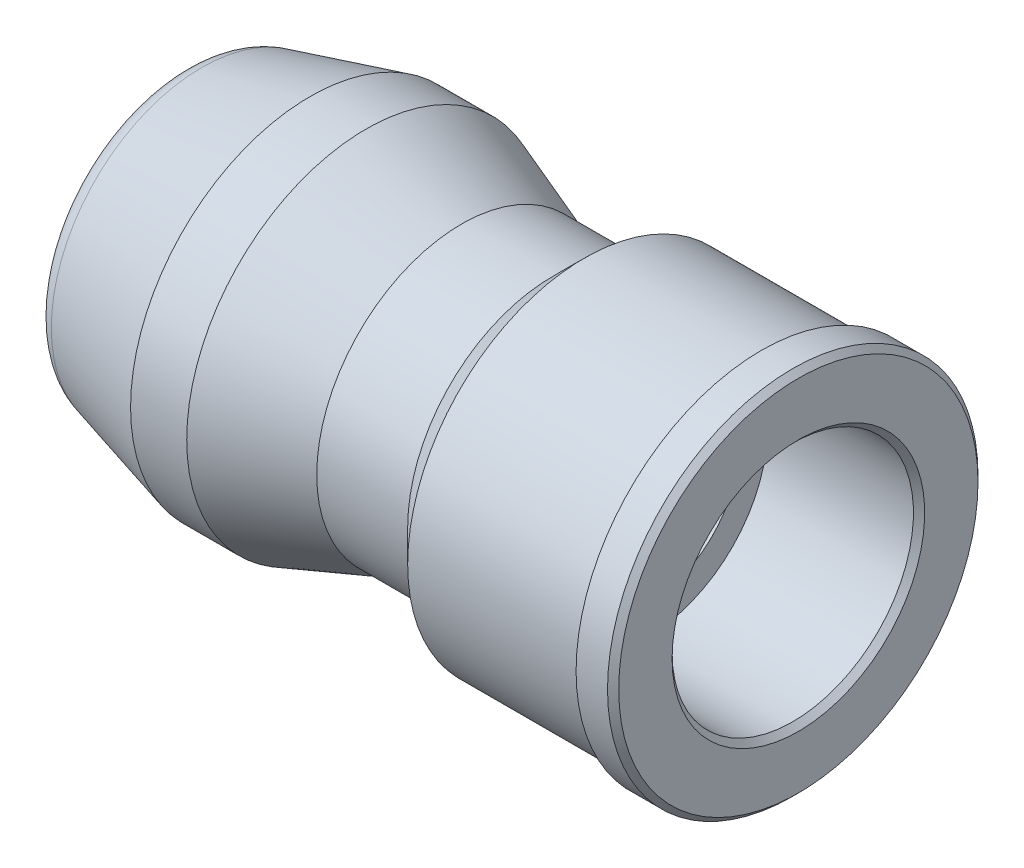
ISO-10303-21;
HEADER;
FILE_DESCRIPTION(('STEP AP214'),'2;1');
FILE_NAME('part.step','',(''),(''),'','','');
FILE_SCHEMA(('AUTOMOTIVE_DESIGN { 1 0 10303 214 1 1 1 1 }'));
ENDSEC;
DATA;
#1=APPLICATION_CONTEXT('core data for automotive mechanical design processes');
#2=APPLICATION_PROTOCOL_DEFINITION('international standard','automotive_design',2000,#1);
#3=PRODUCT_CONTEXT('',#1,'mechanical');
#4=PRODUCT('Part','Part','',(#3));
#5=PRODUCT_RELATED_PRODUCT_CATEGORY('part','',(#4));
#6=PRODUCT_DEFINITION_FORMATION('','',#4);
#7=PRODUCT_DEFINITION_CONTEXT('part definition',#1,'design');
#8=PRODUCT_DEFINITION('design','',#6,#7);
#9=PRODUCT_DEFINITION_SHAPE('','',#8);
#10=(LENGTH_UNIT() NAMED_UNIT(*) SI_UNIT(.MILLI.,.METRE.));
#11=(NAMED_UNIT(*) PLANE_ANGLE_UNIT() SI_UNIT($,.RADIAN.));
#12=(NAMED_UNIT(*) SI_UNIT($,.STERADIAN.) SOLID_ANGLE_UNIT());
#13=UNCERTAINTY_MEASURE_WITH_UNIT(LENGTH_MEASURE(1.E-05),#10,'distance_accuracy_value','');
#14=(GEOMETRIC_REPRESENTATION_CONTEXT(3) GLOBAL_UNCERTAINTY_ASSIGNED_CONTEXT((#13)) GLOBAL_UNIT_ASSIGNED_CONTEXT((#10,
#11,#12)) REPRESENTATION_CONTEXT('',''));
#15=CARTESIAN_POINT('',(0.,0.,0.));
#16=DIRECTION('',(0.,0.,1.));
#17=DIRECTION('',(1.,0.,0.));
#18=AXIS2_PLACEMENT_3D('',#15,#16,#17);
#19=CARTESIAN_POINT('',(-24.3822963616304,0.,0.));
#20=DIRECTION('',(1.,0.,0.));
#21=DIRECTION('',(0.,0.,-1.));
#22=AXIS2_PLACEMENT_3D('',#19,#20,#21);
#23=PLANE('',#22);
#24=CARTESIAN_POINT('',(-24.3822963616304,0.,0.));
#25=DIRECTION('',(1.,0.,0.));
#26=DIRECTION('',(0.,0.,-1.));
#27=AXIS2_PLACEMENT_3D('',#24,#25,#26);
#28=CIRCLE('',#27,2.19633650601052);
#29=CARTESIAN_POINT('',(-24.3822963616304,0.,-2.19633650601052));
#30=VERTEX_POINT('',#29);
#31=EDGE_CURVE('E70',#30,#30,#28,.F.);
#32=ORIENTED_EDGE('',*,*,#31,.T.);
#33=EDGE_LOOP('',(#32));
#34=FACE_BOUND('',#33,.T.);
#35=CARTESIAN_POINT('',(-24.3822963616304,0.,0.));
#36=DIRECTION('',(-1.,0.,0.));
#37=DIRECTION('',(0.,0.,1.));
#38=AXIS2_PLACEMENT_3D('',#35,#36,#37);
#39=CIRCLE('',#38,2.025);
#40=CARTESIAN_POINT('',(-24.3822963616304,0.,2.025));
#41=VERTEX_POINT('',#40);
#42=EDGE_CURVE('E100',#41,#41,#39,.T.);
#43=ORIENTED_EDGE('',*,*,#42,.F.);
#44=EDGE_LOOP('',(#43));
#45=FACE_BOUND('',#44,.T.);
#46=ADVANCED_FACE('F40',(#34,#45),#23,.F.);
#47=CARTESIAN_POINT('',(-22.0822963616304,0.,0.));
#48=DIRECTION('',(1.,0.,0.));
#49=DIRECTION('',(0.,0.,-1.));
#50=AXIS2_PLACEMENT_3D('',#47,#48,#49);
#51=CONICAL_SURFACE('',#50,3.19628314259158,0.261799387799147);
#52=CARTESIAN_POINT('',(-24.0117058841816,0.,0.));
#53=DIRECTION('',(-1.,0.,0.));
#54=DIRECTION('',(0.,0.,1.));
#55=AXIS2_PLACEMENT_3D('',#52,#53,#54);
#56=CIRCLE('',#55,2.67929941915505);
#57=CARTESIAN_POINT('',(-24.0117058841816,0.,2.67929941915505));
#58=VERTEX_POINT('',#57);
#59=EDGE_CURVE('E67',#58,#58,#56,.F.);
#60=ORIENTED_EDGE('',*,*,#59,.T.);
#61=EDGE_LOOP('',(#60));
#62=FACE_BOUND('',#61,.T.);
#63=CARTESIAN_POINT('',(-22.0822963616304,0.,0.));
#64=DIRECTION('',(-1.,0.,0.));
#65=DIRECTION('',(0.,0.,1.));
#66=AXIS2_PLACEMENT_3D('',#63,#64,#65);
#67=CIRCLE('',#66,3.19628314259158);
#68=CARTESIAN_POINT('',(-22.0822963616304,0.,3.19628314259158));
#69=VERTEX_POINT('',#68);
#70=EDGE_CURVE('E73',#69,#69,#67,.T.);
#71=ORIENTED_EDGE('',*,*,#70,.T.);
#72=EDGE_LOOP('',(#71));
#73=FACE_BOUND('',#72,.T.);
#74=ADVANCED_FACE('F107',(#62,#73),#51,.T.);
#75=CARTESIAN_POINT('',(-24.3822963616304,0.,0.));
#76=DIRECTION('',(-1.,0.,0.));
#77=DIRECTION('',(0.,0.,1.));
#78=AXIS2_PLACEMENT_3D('',#75,#76,#77);
#79=CYLINDRICAL_SURFACE('',#78,3.19628314259158);
#80=ORIENTED_EDGE('',*,*,#70,.F.);
#81=EDGE_LOOP('',(#80));
#82=FACE_BOUND('',#81,.T.);
#83=CARTESIAN_POINT('',(-21.0822963616304,0.,0.));
#84=DIRECTION('',(-1.,0.,0.));
#85=DIRECTION('',(0.,0.,1.));
#86=AXIS2_PLACEMENT_3D('',#83,#84,#85);
#87=CIRCLE('',#86,3.19628314259158);
#88=CARTESIAN_POINT('',(-21.0822963616304,0.,3.19628314259158));
#89=VERTEX_POINT('',#88);
#90=EDGE_CURVE('E81',#89,#89,#87,.T.);
#91=ORIENTED_EDGE('',*,*,#90,.T.);
#92=EDGE_LOOP('',(#91));
#93=FACE_BOUND('',#92,.T.);
#94=ADVANCED_FACE('F113',(#82,#93),#79,.T.);
#95=CARTESIAN_POINT('',(-19.3822963616304,0.,0.));
#96=DIRECTION('',(-1.,0.,0.));
#97=DIRECTION('',(0.,0.,1.));
#98=AXIS2_PLACEMENT_3D('',#95,#96,#97);
#99=CONICAL_SURFACE('',#98,2.58,0.347784219086138);
#100=ORIENTED_EDGE('',*,*,#90,.F.);
#101=EDGE_LOOP('',(#100));
#102=FACE_BOUND('',#101,.T.);
#103=CARTESIAN_POINT('',(-19.3822963616304,0.,0.));
#104=DIRECTION('',(-1.,0.,0.));
#105=DIRECTION('',(0.,0.,1.));
#106=AXIS2_PLACEMENT_3D('',#103,#104,#105);
#107=CIRCLE('',#106,2.58);
#108=CARTESIAN_POINT('',(-19.3822963616304,0.,2.58));
#109=VERTEX_POINT('',#108);
#110=EDGE_CURVE('E84',#109,#109,#107,.T.);
#111=ORIENTED_EDGE('',*,*,#110,.T.);
#112=EDGE_LOOP('',(#111));
#113=FACE_BOUND('',#112,.T.);
#114=ADVANCED_FACE('F172',(#102,#113),#99,.T.);
#115=CARTESIAN_POINT('',(-24.3822963616304,0.,0.));
#116=DIRECTION('',(-1.,0.,0.));
#117=DIRECTION('',(0.,0.,1.));
#118=AXIS2_PLACEMENT_3D('',#115,#116,#117);
#119=CYLINDRICAL_SURFACE('',#118,2.58);
#120=ORIENTED_EDGE('',*,*,#110,.F.);
#121=EDGE_LOOP('',(#120));
#122=FACE_BOUND('',#121,.T.);
#123=CARTESIAN_POINT('',(-17.7622963616304,0.,0.));
#124=DIRECTION('',(-1.,0.,0.));
#125=DIRECTION('',(0.,0.,1.));
#126=AXIS2_PLACEMENT_3D('',#123,#124,#125);
#127=CIRCLE('',#126,2.58);
#128=CARTESIAN_POINT('',(-17.7622963616304,0.,2.58));
#129=VERTEX_POINT('',#128);
#130=EDGE_CURVE('E87',#129,#129,#127,.T.);
#131=ORIENTED_EDGE('',*,*,#130,.T.);
#132=EDGE_LOOP('',(#131));
#133=FACE_BOUND('',#132,.T.);
#134=ADVANCED_FACE('F168',(#122,#133),#119,.T.);
#135=CARTESIAN_POINT('',(-17.1922963616304,0.,0.));
#136=DIRECTION('',(1.,0.,0.));
#137=DIRECTION('',(0.,0.,-1.));
#138=AXIS2_PLACEMENT_3D('',#135,#136,#137);
#139=CONICAL_SURFACE('',#138,3.15,0.78539816339745);
#140=ORIENTED_EDGE('',*,*,#130,.F.);
#141=EDGE_LOOP('',(#140));
#142=FACE_BOUND('',#141,.T.);
#143=CARTESIAN_POINT('',(-17.1922963616304,0.,0.));
#144=DIRECTION('',(-1.,0.,0.));
#145=DIRECTION('',(0.,0.,1.));
#146=AXIS2_PLACEMENT_3D('',#143,#144,#145);
#147=CIRCLE('',#146,3.15);
#148=CARTESIAN_POINT('',(-17.1922963616304,0.,3.15));
#149=VERTEX_POINT('',#148);
#150=EDGE_CURVE('E90',#149,#149,#147,.T.);
#151=ORIENTED_EDGE('',*,*,#150,.T.);
#152=EDGE_LOOP('',(#151));
#153=FACE_BOUND('',#152,.T.);
#154=ADVANCED_FACE('F165',(#142,#153),#139,.T.);
#155=CARTESIAN_POINT('',(-24.3822963616304,0.,0.));
#156=DIRECTION('',(-1.,0.,0.));
#157=DIRECTION('',(0.,0.,1.));
#158=AXIS2_PLACEMENT_3D('',#155,#156,#157);
#159=CYLINDRICAL_SURFACE('',#158,3.15);
#160=CARTESIAN_POINT('',(-14.1422963616304,0.,0.));
#161=DIRECTION('',(1.,0.,0.));
#162=DIRECTION('',(0.,0.,-1.));
#163=AXIS2_PLACEMENT_3D('',#160,#161,#162);
#164=CIRCLE('',#163,3.15);
#165=CARTESIAN_POINT('',(-14.1422963616304,0.,-3.15));
#166=VERTEX_POINT('',#165);
#167=EDGE_CURVE('E48',#166,#166,#164,.F.);
#168=ORIENTED_EDGE('',*,*,#167,.T.);
#169=EDGE_LOOP('',(#168));
#170=FACE_BOUND('',#169,.T.);
#171=ORIENTED_EDGE('',*,*,#150,.F.);
#172=EDGE_LOOP('',(#171));
#173=FACE_BOUND('',#172,.T.);
#174=ADVANCED_FACE('F162',(#170,#173),#159,.T.);
#175=CARTESIAN_POINT('',(-14.0422963616304,3.15,0.));
#176=DIRECTION('',(1.,0.,0.));
#177=DIRECTION('',(0.,0.,-1.));
#178=AXIS2_PLACEMENT_3D('',#175,#176,#177);
#179=PLANE('',#178);
#180=CARTESIAN_POINT('',(-14.0422963616304,0.,0.));
#181=DIRECTION('',(1.,0.,0.));
#182=DIRECTION('',(0.,0.,-1.));
#183=AXIS2_PLACEMENT_3D('',#180,#181,#182);
#184=CIRCLE('',#183,3.25);
#185=CARTESIAN_POINT('',(-14.0422963616304,0.,-3.25));
#186=VERTEX_POINT('',#185);
#187=EDGE_CURVE('E10',#186,#186,#184,.T.);
#188=ORIENTED_EDGE('',*,*,#187,.T.);
#189=EDGE_LOOP('',(#188));
#190=FACE_BOUND('',#189,.T.);
#191=CARTESIAN_POINT('',(-14.0422963616304,0.,0.));
#192=DIRECTION('',(-1.,0.,0.));
#193=DIRECTION('',(0.,0.,1.));
#194=AXIS2_PLACEMENT_3D('',#191,#192,#193);
#195=CIRCLE('',#194,3.3);
#196=CARTESIAN_POINT('',(-14.0422963616304,0.,3.3));
#197=VERTEX_POINT('',#196);
#198=EDGE_CURVE('E93',#197,#197,#195,.T.);
#199=ORIENTED_EDGE('',*,*,#198,.T.);
#200=EDGE_LOOP('',(#199));
#201=FACE_BOUND('',#200,.T.);
#202=ADVANCED_FACE('F155',(#190,#201),#179,.F.);
#203=CARTESIAN_POINT('',(-24.3822963616304,0.,0.));
#204=DIRECTION('',(-1.,0.,0.));
#205=DIRECTION('',(0.,0.,1.));
#206=AXIS2_PLACEMENT_3D('',#203,#204,#205);
#207=CYLINDRICAL_SURFACE('',#206,3.3);
#208=CARTESIAN_POINT('',(-13.4822963616304,0.,0.));
#209=DIRECTION('',(-1.,0.,0.));
#210=DIRECTION('',(0.,0.,1.));
#211=AXIS2_PLACEMENT_3D('',#208,#209,#210);
#212=CIRCLE('',#211,3.3);
#213=CARTESIAN_POINT('',(-13.4822963616304,0.,3.3));
#214=VERTEX_POINT('',#213);
#215=EDGE_CURVE('E64',#214,#214,#212,.T.);
#216=ORIENTED_EDGE('',*,*,#215,.T.);
#217=EDGE_LOOP('',(#216));
#218=FACE_BOUND('',#217,.T.);
#219=ORIENTED_EDGE('',*,*,#198,.F.);
#220=EDGE_LOOP('',(#219));
#221=FACE_BOUND('',#220,.T.);
#222=ADVANCED_FACE('F145',(#218,#221),#207,.T.);
#223=CARTESIAN_POINT('',(-13.3822963616304,3.3,0.));
#224=DIRECTION('',(-1.,0.,0.));
#225=DIRECTION('',(0.,0.,1.));
#226=AXIS2_PLACEMENT_3D('',#223,#224,#225);
#227=PLANE('',#226);
#228=CARTESIAN_POINT('',(-13.3822963616304,0.,0.));
#229=DIRECTION('',(-1.,0.,0.));
#230=DIRECTION('',(0.,0.,1.));
#231=AXIS2_PLACEMENT_3D('',#228,#229,#230);
#232=CIRCLE('',#231,3.2);
#233=CARTESIAN_POINT('',(-13.3822963616304,0.,3.2));
#234=VERTEX_POINT('',#233);
#235=EDGE_CURVE('E56',#234,#234,#232,.F.);
#236=ORIENTED_EDGE('',*,*,#235,.T.);
#237=EDGE_LOOP('',(#236));
#238=FACE_BOUND('',#237,.T.);
#239=CARTESIAN_POINT('',(-13.3822963616304,0.,0.));
#240=DIRECTION('',(-1.,0.,0.));
#241=DIRECTION('',(0.,0.,1.));
#242=AXIS2_PLACEMENT_3D('',#239,#240,#241);
#243=CIRCLE('',#242,2.25);
#244=CARTESIAN_POINT('',(-13.3822963616304,0.,2.25));
#245=VERTEX_POINT('',#244);
#246=EDGE_CURVE('E61',#245,#245,#243,.T.);
#247=ORIENTED_EDGE('',*,*,#246,.T.);
#248=EDGE_LOOP('',(#247));
#249=FACE_BOUND('',#248,.T.);
#250=ADVANCED_FACE('F142',(#238,#249),#227,.F.);
#251=CARTESIAN_POINT('',(-24.3822963616304,0.,0.));
#252=DIRECTION('',(-1.,0.,0.));
#253=DIRECTION('',(0.,0.,1.));
#254=AXIS2_PLACEMENT_3D('',#251,#252,#253);
#255=CYLINDRICAL_SURFACE('',#254,2.15);
#256=CARTESIAN_POINT('',(-13.4822963616304,0.,0.));
#257=DIRECTION('',(-1.,0.,0.));
#258=DIRECTION('',(0.,0.,1.));
#259=AXIS2_PLACEMENT_3D('',#256,#257,#258);
#260=CIRCLE('',#259,2.15);
#261=CARTESIAN_POINT('',(-13.4822963616304,0.,2.15));
#262=VERTEX_POINT('',#261);
#263=EDGE_CURVE('E52',#262,#262,#260,.F.);
#264=ORIENTED_EDGE('',*,*,#263,.T.);
#265=EDGE_LOOP('',(#264));
#266=FACE_BOUND('',#265,.T.);
#267=CARTESIAN_POINT('',(-16.0822963616304,0.,0.));
#268=DIRECTION('',(-1.,0.,0.));
#269=DIRECTION('',(0.,0.,1.));
#270=AXIS2_PLACEMENT_3D('',#267,#268,#269);
#271=CIRCLE('',#270,2.15);
#272=CARTESIAN_POINT('',(-16.0822963616304,0.,2.15));
#273=VERTEX_POINT('',#272);
#274=EDGE_CURVE('E77',#273,#273,#271,.T.);
#275=ORIENTED_EDGE('',*,*,#274,.T.);
#276=EDGE_LOOP('',(#275));
#277=FACE_BOUND('',#276,.T.);
#278=ADVANCED_FACE('F144',(#266,#277),#255,.F.);
#279=CARTESIAN_POINT('',(-16.0822963616304,2.15,0.));
#280=DIRECTION('',(-1.,0.,0.));
#281=DIRECTION('',(0.,0.,1.));
#282=AXIS2_PLACEMENT_3D('',#279,#280,#281);
#283=PLANE('',#282);
#284=CARTESIAN_POINT('',(-16.0822963616304,0.,0.));
#285=DIRECTION('',(-1.,0.,0.));
#286=DIRECTION('',(0.,0.,1.));
#287=AXIS2_PLACEMENT_3D('',#284,#285,#286);
#288=CIRCLE('',#287,1.65);
#289=CARTESIAN_POINT('',(-16.0822963616304,0.,1.65));
#290=VERTEX_POINT('',#289);
#291=EDGE_CURVE('E74',#290,#290,#288,.T.);
#292=ORIENTED_EDGE('',*,*,#291,.T.);
#293=EDGE_LOOP('',(#292));
#294=FACE_BOUND('',#293,.T.);
#295=ORIENTED_EDGE('',*,*,#274,.F.);
#296=EDGE_LOOP('',(#295));
#297=FACE_BOUND('',#296,.T.);
#298=ADVANCED_FACE('F152',(#294,#297),#283,.F.);
#299=CARTESIAN_POINT('',(-24.3822963616304,0.,0.));
#300=DIRECTION('',(-1.,0.,0.));
#301=DIRECTION('',(0.,0.,1.));
#302=AXIS2_PLACEMENT_3D('',#299,#300,#301);
#303=CYLINDRICAL_SURFACE('',#302,1.65);
#304=CARTESIAN_POINT('',(-24.0072963616304,0.,0.));
#305=DIRECTION('',(-1.,0.,0.));
#306=DIRECTION('',(0.,0.,1.));
#307=AXIS2_PLACEMENT_3D('',#304,#305,#306);
#308=CIRCLE('',#307,1.65);
#309=CARTESIAN_POINT('',(-24.0072963616304,0.,1.65));
#310=VERTEX_POINT('',#309);
#311=EDGE_CURVE('E78',#310,#310,#308,.T.);
#312=ORIENTED_EDGE('',*,*,#311,.T.);
#313=EDGE_LOOP('',(#312));
#314=FACE_BOUND('',#313,.T.);
#315=ORIENTED_EDGE('',*,*,#291,.F.);
#316=EDGE_LOOP('',(#315));
#317=FACE_BOUND('',#316,.T.);
#318=ADVANCED_FACE('F258',(#314,#317),#303,.F.);
#319=CARTESIAN_POINT('',(-24.3822963616304,0.,0.));
#320=DIRECTION('',(-1.,0.,0.));
#321=DIRECTION('',(0.,0.,1.));
#322=AXIS2_PLACEMENT_3D('',#319,#320,#321);
#323=CONICAL_SURFACE('',#322,2.025,0.785398163397452);
#324=ORIENTED_EDGE('',*,*,#311,.F.);
#325=EDGE_LOOP('',(#324));
#326=FACE_BOUND('',#325,.T.);
#327=ORIENTED_EDGE('',*,*,#42,.T.);
#328=EDGE_LOOP('',(#327));
#329=FACE_BOUND('',#328,.T.);
#330=ADVANCED_FACE('F104',(#326,#329),#323,.F.);
#331=CARTESIAN_POINT('',(-23.8822963616304,0.,0.));
#332=DIRECTION('',(1.,0.,0.));
#333=DIRECTION('',(0.,0.,-1.));
#334=AXIS2_PLACEMENT_3D('',#331,#332,#333);
#335=TOROIDAL_SURFACE('',#334,2.19633650601052,0.5);
#336=ORIENTED_EDGE('',*,*,#59,.F.);
#337=EDGE_LOOP('',(#336));
#338=FACE_BOUND('',#337,.T.);
#339=ORIENTED_EDGE('',*,*,#31,.F.);
#340=EDGE_LOOP('',(#339));
#341=FACE_BOUND('',#340,.T.);
#342=ADVANCED_FACE('F118',(#338,#341),#335,.T.);
#343=CARTESIAN_POINT('',(-13.4822963616304,0.,0.));
#344=DIRECTION('',(-1.,0.,0.));
#345=DIRECTION('',(0.,0.,1.));
#346=AXIS2_PLACEMENT_3D('',#343,#344,#345);
#347=CONICAL_SURFACE('',#346,3.3,0.785398163397453);
#348=ORIENTED_EDGE('',*,*,#235,.F.);
#349=EDGE_LOOP('',(#348));
#350=FACE_BOUND('',#349,.T.);
#351=ORIENTED_EDGE('',*,*,#215,.F.);
#352=EDGE_LOOP('',(#351));
#353=FACE_BOUND('',#352,.T.);
#354=ADVANCED_FACE('F121',(#350,#353),#347,.T.);
#355=CARTESIAN_POINT('',(-13.3822963616304,0.,0.));
#356=DIRECTION('',(1.,0.,0.));
#357=DIRECTION('',(0.,0.,-1.));
#358=AXIS2_PLACEMENT_3D('',#355,#356,#357);
#359=CONICAL_SURFACE('',#358,2.25,0.785398163397424);
#360=ORIENTED_EDGE('',*,*,#263,.F.);
#361=EDGE_LOOP('',(#360));
#362=FACE_BOUND('',#361,.T.);
#363=ORIENTED_EDGE('',*,*,#246,.F.);
#364=EDGE_LOOP('',(#363));
#365=FACE_BOUND('',#364,.T.);
#366=ADVANCED_FACE('F128',(#362,#365),#359,.F.);
#367=CARTESIAN_POINT('',(-14.1422963616304,0.,0.));
#368=DIRECTION('',(1.,0.,0.));
#369=DIRECTION('',(0.,0.,-1.));
#370=AXIS2_PLACEMENT_3D('',#367,#368,#369);
#371=CONICAL_SURFACE('',#370,3.15,0.785398163397446);
#372=ORIENTED_EDGE('',*,*,#187,.F.);
#373=EDGE_LOOP('',(#372));
#374=FACE_BOUND('',#373,.T.);
#375=ORIENTED_EDGE('',*,*,#167,.F.);
#376=EDGE_LOOP('',(#375));
#377=FACE_BOUND('',#376,.T.);
#378=ADVANCED_FACE('F43',(#374,#377),#371,.T.);
#379=CLOSED_SHELL('',(#46,#74,#94,#114,#134,#154,#174,#202,#222,#250,#278,#298,#318,#330,#342,
#354,#366,#378));
#380=MANIFOLD_SOLID_BREP('B2',#379);
#381=ADVANCED_BREP_SHAPE_REPRESENTATION('',(#18,#380),#14);
#382=SHAPE_DEFINITION_REPRESENTATION(#9,#381);
ENDSEC;
END-ISO-10303-21;
